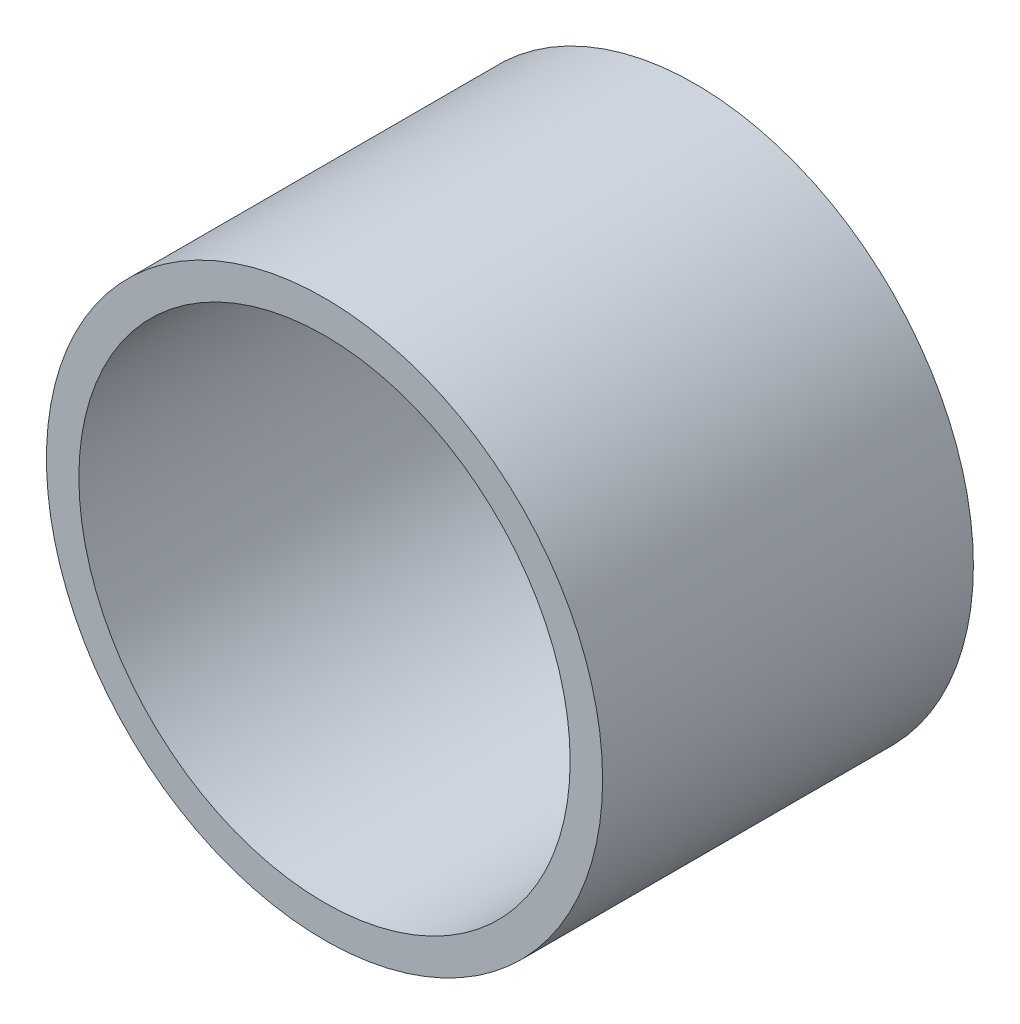
ISO-10303-21;
HEADER;
FILE_DESCRIPTION(('STEP AP214'),'2;1');
FILE_NAME('part.step','',(''),(''),'','','');
FILE_SCHEMA(('AUTOMOTIVE_DESIGN { 1 0 10303 214 1 1 1 1 }'));
ENDSEC;
DATA;
#1=APPLICATION_CONTEXT('core data for automotive mechanical design processes');
#2=APPLICATION_PROTOCOL_DEFINITION('international standard','automotive_design',2000,#1);
#3=PRODUCT_CONTEXT('',#1,'mechanical');
#4=PRODUCT('Part','Part','',(#3));
#5=PRODUCT_RELATED_PRODUCT_CATEGORY('part','',(#4));
#6=PRODUCT_DEFINITION_FORMATION('','',#4);
#7=PRODUCT_DEFINITION_CONTEXT('part definition',#1,'design');
#8=PRODUCT_DEFINITION('design','',#6,#7);
#9=PRODUCT_DEFINITION_SHAPE('','',#8);
#10=(LENGTH_UNIT() NAMED_UNIT(*) SI_UNIT(.MILLI.,.METRE.));
#11=(NAMED_UNIT(*) PLANE_ANGLE_UNIT() SI_UNIT($,.RADIAN.));
#12=(NAMED_UNIT(*) SI_UNIT($,.STERADIAN.) SOLID_ANGLE_UNIT());
#13=UNCERTAINTY_MEASURE_WITH_UNIT(LENGTH_MEASURE(1.E-05),#10,'distance_accuracy_value','');
#14=(GEOMETRIC_REPRESENTATION_CONTEXT(3) GLOBAL_UNCERTAINTY_ASSIGNED_CONTEXT((#13)) GLOBAL_UNIT_ASSIGNED_CONTEXT((#10,
#11,#12)) REPRESENTATION_CONTEXT('',''));
#15=CARTESIAN_POINT('',(0.,0.,0.));
#16=DIRECTION('',(0.,0.,1.));
#17=DIRECTION('',(1.,0.,0.));
#18=AXIS2_PLACEMENT_3D('',#15,#16,#17);
#19=CARTESIAN_POINT('',(0.,0.,8.));
#20=DIRECTION('',(0.,0.,-1.));
#21=DIRECTION('',(-1.,0.,0.));
#22=AXIS2_PLACEMENT_3D('',#19,#20,#21);
#23=CYLINDRICAL_SURFACE('',#22,6.);
#24=CARTESIAN_POINT('',(0.,0.,8.));
#25=DIRECTION('',(0.,0.,1.));
#26=DIRECTION('',(1.,0.,0.));
#27=AXIS2_PLACEMENT_3D('',#24,#25,#26);
#28=CIRCLE('',#27,6.);
#29=CARTESIAN_POINT('',(6.,0.,8.));
#30=VERTEX_POINT('',#29);
#31=EDGE_CURVE('E10',#30,#30,#28,.T.);
#32=ORIENTED_EDGE('',*,*,#31,.F.);
#33=EDGE_LOOP('',(#32));
#34=FACE_BOUND('',#33,.T.);
#35=CARTESIAN_POINT('',(0.,0.,0.));
#36=DIRECTION('',(0.,0.,1.));
#37=DIRECTION('',(1.,0.,0.));
#38=AXIS2_PLACEMENT_3D('',#35,#36,#37);
#39=CIRCLE('',#38,6.);
#40=CARTESIAN_POINT('',(6.,0.,0.));
#41=VERTEX_POINT('',#40);
#42=EDGE_CURVE('E44',#41,#41,#39,.T.);
#43=ORIENTED_EDGE('',*,*,#42,.T.);
#44=EDGE_LOOP('',(#43));
#45=FACE_BOUND('',#44,.T.);
#46=ADVANCED_FACE('F41',(#34,#45),#23,.T.);
#47=CARTESIAN_POINT('',(0.,0.,8.));
#48=DIRECTION('',(0.,0.,1.));
#49=DIRECTION('',(1.,0.,0.));
#50=AXIS2_PLACEMENT_3D('',#47,#48,#49);
#51=PLANE('',#50);
#52=CARTESIAN_POINT('',(0.,0.,8.));
#53=DIRECTION('',(0.,0.,1.));
#54=DIRECTION('',(1.,0.,0.));
#55=AXIS2_PLACEMENT_3D('',#52,#53,#54);
#56=CIRCLE('',#55,5.3);
#57=CARTESIAN_POINT('',(5.3,0.,8.));
#58=VERTEX_POINT('',#57);
#59=EDGE_CURVE('E51',#58,#58,#56,.T.);
#60=ORIENTED_EDGE('',*,*,#59,.F.);
#61=EDGE_LOOP('',(#60));
#62=FACE_BOUND('',#61,.T.);
#63=ORIENTED_EDGE('',*,*,#31,.T.);
#64=EDGE_LOOP('',(#63));
#65=FACE_BOUND('',#64,.T.);
#66=ADVANCED_FACE('F62',(#62,#65),#51,.T.);
#67=CARTESIAN_POINT('',(0.,0.,0.));
#68=DIRECTION('',(0.,0.,1.));
#69=DIRECTION('',(1.,0.,0.));
#70=AXIS2_PLACEMENT_3D('',#67,#68,#69);
#71=PLANE('',#70);
#72=CARTESIAN_POINT('',(0.,0.,0.));
#73=DIRECTION('',(0.,0.,1.));
#74=DIRECTION('',(1.,0.,0.));
#75=AXIS2_PLACEMENT_3D('',#72,#73,#74);
#76=CIRCLE('',#75,5.3);
#77=CARTESIAN_POINT('',(5.3,0.,0.));
#78=VERTEX_POINT('',#77);
#79=EDGE_CURVE('E53',#78,#78,#76,.T.);
#80=ORIENTED_EDGE('',*,*,#79,.T.);
#81=EDGE_LOOP('',(#80));
#82=FACE_BOUND('',#81,.T.);
#83=ORIENTED_EDGE('',*,*,#42,.F.);
#84=EDGE_LOOP('',(#83));
#85=FACE_BOUND('',#84,.T.);
#86=ADVANCED_FACE('F64',(#82,#85),#71,.F.);
#87=CARTESIAN_POINT('',(0.,0.,8.));
#88=DIRECTION('',(0.,0.,-1.));
#89=DIRECTION('',(-1.,0.,0.));
#90=AXIS2_PLACEMENT_3D('',#87,#88,#89);
#91=CYLINDRICAL_SURFACE('',#90,5.3);
#92=ORIENTED_EDGE('',*,*,#59,.T.);
#93=EDGE_LOOP('',(#92));
#94=FACE_BOUND('',#93,.T.);
#95=ORIENTED_EDGE('',*,*,#79,.F.);
#96=EDGE_LOOP('',(#95));
#97=FACE_BOUND('',#96,.T.);
#98=ADVANCED_FACE('F59',(#94,#97),#91,.F.);
#99=CLOSED_SHELL('',(#46,#66,#86,#98));
#100=MANIFOLD_SOLID_BREP('B2',#99);
#101=ADVANCED_BREP_SHAPE_REPRESENTATION('',(#18,#100),#14);
#102=SHAPE_DEFINITION_REPRESENTATION(#9,#101);
ENDSEC;
END-ISO-10303-21;
